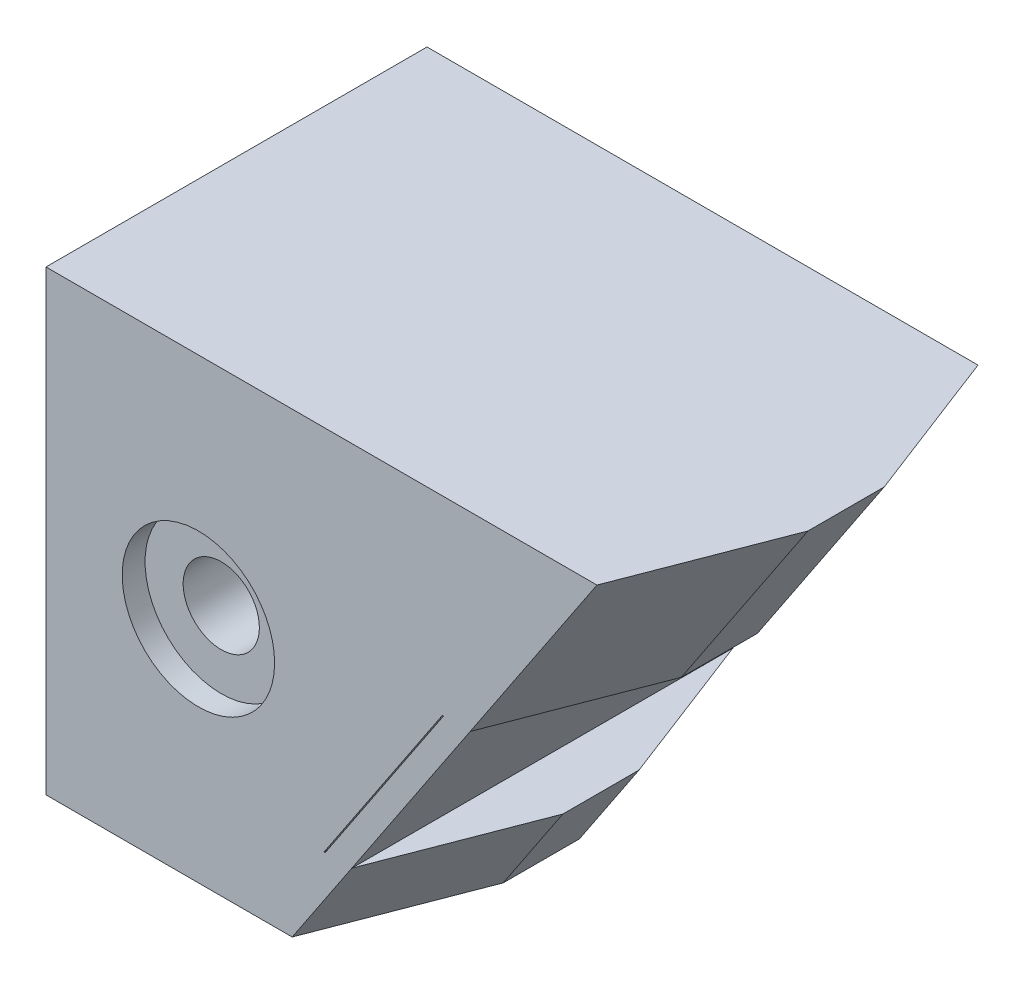
ISO-10303-21;
HEADER;
FILE_DESCRIPTION(('STEP AP214'),'2;1');
FILE_NAME('part.step','',(''),(''),'','','');
FILE_SCHEMA(('AUTOMOTIVE_DESIGN { 1 0 10303 214 1 1 1 1 }'));
ENDSEC;
DATA;
#1=APPLICATION_CONTEXT('core data for automotive mechanical design processes');
#2=APPLICATION_PROTOCOL_DEFINITION('international standard','automotive_design',2000,#1);
#3=PRODUCT_CONTEXT('',#1,'mechanical');
#4=PRODUCT('Part','Part','',(#3));
#5=PRODUCT_RELATED_PRODUCT_CATEGORY('part','',(#4));
#6=PRODUCT_DEFINITION_FORMATION('','',#4);
#7=PRODUCT_DEFINITION_CONTEXT('part definition',#1,'design');
#8=PRODUCT_DEFINITION('design','',#6,#7);
#9=PRODUCT_DEFINITION_SHAPE('','',#8);
#10=(LENGTH_UNIT() NAMED_UNIT(*) SI_UNIT(.MILLI.,.METRE.));
#11=(NAMED_UNIT(*) PLANE_ANGLE_UNIT() SI_UNIT($,.RADIAN.));
#12=(NAMED_UNIT(*) SI_UNIT($,.STERADIAN.) SOLID_ANGLE_UNIT());
#13=UNCERTAINTY_MEASURE_WITH_UNIT(LENGTH_MEASURE(1.E-05),#10,'distance_accuracy_value','');
#14=(GEOMETRIC_REPRESENTATION_CONTEXT(3) GLOBAL_UNCERTAINTY_ASSIGNED_CONTEXT((#13)) GLOBAL_UNIT_ASSIGNED_CONTEXT((#10,
#11,#12)) REPRESENTATION_CONTEXT('',''));
#15=CARTESIAN_POINT('',(0.,0.,0.));
#16=DIRECTION('',(0.,0.,1.));
#17=DIRECTION('',(1.,0.,0.));
#18=AXIS2_PLACEMENT_3D('',#15,#16,#17);
#19=CARTESIAN_POINT('',(0.,75.2062451279246,-50.));
#20=DIRECTION('',(0.,-1.,0.));
#21=DIRECTION('',(1.,0.,0.));
#22=AXIS2_PLACEMENT_3D('',#19,#20,#21);
#23=PLANE('',#22);
#24=DIRECTION('',(0.35911281384207,0.,-0.933294158845126));
#25=VECTOR('',#24,1.);
#26=CARTESIAN_POINT('',(0.399891815671286,75.2062451279246,-13.543816152655));
#27=LINE('',#26,#25);
#28=CARTESIAN_POINT('',(-4.81149612953786,75.2062451279246,0.));
#29=VERTEX_POINT('',#28);
#30=CARTESIAN_POINT('',(2.88410145753901,75.2062451279247,-20.));
#31=VERTEX_POINT('',#30);
#32=EDGE_CURVE('E60',#29,#31,#27,.T.);
#33=ORIENTED_EDGE('',*,*,#32,.T.);
#34=DIRECTION('',(0.,0.,1.));
#35=VECTOR('',#34,1.);
#36=CARTESIAN_POINT('',(2.88410145753922,75.2062451279246,-50.));
#37=LINE('',#36,#35);
#38=CARTESIAN_POINT('',(2.88410145753922,75.2062451279246,-29.9999999999994));
#39=VERTEX_POINT('',#38);
#40=EDGE_CURVE('E184',#39,#31,#37,.T.);
#41=ORIENTED_EDGE('',*,*,#40,.F.);
#42=DIRECTION('',(-0.35911281384207,0.,-0.933294158845126));
#43=VECTOR('',#42,1.);
#44=CARTESIAN_POINT('',(17.1577863919333,75.2062451279246,7.09571549937649));
#45=LINE('',#44,#43);
#46=CARTESIAN_POINT('',(-4.81149612953786,75.2062451279246,-50.));
#47=VERTEX_POINT('',#46);
#48=EDGE_CURVE('E245',#39,#47,#45,.T.);
#49=ORIENTED_EDGE('',*,*,#48,.T.);
#50=DIRECTION('',(1.,0.,0.));
#51=VECTOR('',#50,1.);
#52=CARTESIAN_POINT('',(0.,75.2062451279246,-50.));
#53=LINE('',#52,#51);
#54=CARTESIAN_POINT('',(-77.1158985424608,75.2062451279246,-50.));
#55=VERTEX_POINT('',#54);
#56=EDGE_CURVE('E200',#55,#47,#53,.T.);
#57=ORIENTED_EDGE('',*,*,#56,.F.);
#58=DIRECTION('',(0.,0.,1.));
#59=VECTOR('',#58,1.);
#60=CARTESIAN_POINT('',(-77.1158985424608,75.2062451279246,-50.));
#61=LINE('',#60,#59);
#62=CARTESIAN_POINT('',(-77.1158985424608,75.2062451279246,0.));
#63=VERTEX_POINT('',#62);
#64=EDGE_CURVE('E44',#55,#63,#61,.T.);
#65=ORIENTED_EDGE('',*,*,#64,.T.);
#66=DIRECTION('',(1.,0.,0.));
#67=VECTOR('',#66,1.);
#68=CARTESIAN_POINT('',(0.,75.2062451279246,0.));
#69=LINE('',#68,#67);
#70=EDGE_CURVE('E177',#63,#29,#69,.T.);
#71=ORIENTED_EDGE('',*,*,#70,.T.);
#72=EDGE_LOOP('',(#33,#41,#49,#57,#65,#71));
#73=FACE_BOUND('',#72,.T.);
#74=ADVANCED_FACE('F35',(#73),#23,.F.);
#75=CARTESIAN_POINT('',(-32.7138890499765,21.809259366651,-50.));
#76=DIRECTION('',(-0.832050294337844,0.554700196225229,0.));
#77=DIRECTION('',(-0.554700196225229,-0.832050294337844,0.));
#78=AXIS2_PLACEMENT_3D('',#75,#76,#77);
#79=PLANE('',#78);
#80=DIRECTION('',(-0.554700196225226,-0.832050294337846,0.));
#81=VECTOR('',#80,1.);
#82=CARTESIAN_POINT('',(2.88487068830827,75.2073989740786,-20.));
#83=LINE('',#82,#81);
#84=CARTESIAN_POINT('',(-13.7569044292177,50.2447362977893,-20.0000000000004));
#85=VERTEX_POINT('',#84);
#86=EDGE_CURVE('E263',#31,#85,#83,.T.);
#87=ORIENTED_EDGE('',*,*,#86,.T.);
#88=DIRECTION('',(0.,0.,1.));
#89=VECTOR('',#88,1.);
#90=CARTESIAN_POINT('',(-13.7569044292177,50.2447362977893,-50.));
#91=LINE('',#90,#89);
#92=CARTESIAN_POINT('',(-13.7569044292178,50.2447362977893,-30.));
#93=VERTEX_POINT('',#92);
#94=EDGE_CURVE('E187',#93,#85,#91,.T.);
#95=ORIENTED_EDGE('',*,*,#94,.F.);
#96=DIRECTION('',(-0.554700196225226,-0.832050294337846,0.));
#97=VECTOR('',#96,1.);
#98=CARTESIAN_POINT('',(2.88487068830825,75.2073989740786,-30.));
#99=LINE('',#98,#97);
#100=EDGE_CURVE('E255',#39,#93,#99,.T.);
#101=ORIENTED_EDGE('',*,*,#100,.F.);
#102=ORIENTED_EDGE('',*,*,#40,.T.);
#103=EDGE_LOOP('',(#87,#95,#101,#102));
#104=FACE_BOUND('',#103,.T.);
#105=ADVANCED_FACE('F301',(#104),#79,.F.);
#106=CARTESIAN_POINT('',(0.,50.2447362977893,-50.));
#107=DIRECTION('',(0.,1.,0.));
#108=DIRECTION('',(0.,0.,1.));
#109=AXIS2_PLACEMENT_3D('',#106,#107,#108);
#110=PLANE('',#109);
#111=DIRECTION('',(-0.35911281384207,0.,0.933294158845126));
#112=VECTOR('',#111,1.);
#113=CARTESIAN_POINT('',(-14.0950564524933,50.2447362977893,-19.1211805985195));
#114=LINE('',#113,#112);
#115=CARTESIAN_POINT('',(-21.4525020162946,50.2447362977893,0.));
#116=VERTEX_POINT('',#115);
#117=EDGE_CURVE('E260',#85,#116,#114,.T.);
#118=ORIENTED_EDGE('',*,*,#117,.T.);
#119=DIRECTION('',(0.,0.,1.));
#120=VECTOR('',#119,1.);
#121=CARTESIAN_POINT('',(-21.4525020162946,50.2447362977893,0.));
#122=LINE('',#121,#120);
#123=CARTESIAN_POINT('',(-21.4525020162946,50.2447362977893,-50.));
#124=VERTEX_POINT('',#123);
#125=EDGE_CURVE('E228',#124,#116,#122,.T.);
#126=ORIENTED_EDGE('',*,*,#125,.F.);
#127=DIRECTION('',(0.35911281384207,0.,0.933294158845126));
#128=VECTOR('',#127,1.);
#129=CARTESIAN_POINT('',(2.6628381237687,50.2447362977893,12.673079945241));
#130=LINE('',#129,#128);
#131=EDGE_CURVE('E250',#124,#93,#130,.T.);
#132=ORIENTED_EDGE('',*,*,#131,.T.);
#133=ORIENTED_EDGE('',*,*,#94,.T.);
#134=EDGE_LOOP('',(#118,#126,#132,#133));
#135=FACE_BOUND('',#134,.T.);
#136=ADVANCED_FACE('F306',(#135),#110,.F.);
#137=CARTESIAN_POINT('',(0.,0.,-50.));
#138=DIRECTION('',(0.,0.,1.));
#139=DIRECTION('',(1.,0.,0.));
#140=AXIS2_PLACEMENT_3D('',#137,#138,#139);
#141=PLANE('',#140);
#142=CARTESIAN_POINT('',(-57.1158985424608,45.2062451279246,-50.));
#143=DIRECTION('',(0.,0.,1.));
#144=DIRECTION('',(1.,0.,0.));
#145=AXIS2_PLACEMENT_3D('',#142,#143,#144);
#146=CIRCLE('',#145,5.00000003299998);
#147=CARTESIAN_POINT('',(-52.1158985094608,45.2062451279246,-50.));
#148=VERTEX_POINT('',#147);
#149=EDGE_CURVE('E163',#148,#148,#146,.T.);
#150=ORIENTED_EDGE('',*,*,#149,.T.);
#151=EDGE_LOOP('',(#150));
#152=FACE_BOUND('',#151,.T.);
#153=DIRECTION('',(-0.554700196225226,-0.832050294337846,0.));
#154=VECTOR('',#153,1.);
#155=CARTESIAN_POINT('',(-4.86833480752101,80.3769396721483,-50.));
#156=LINE('',#155,#154);
#157=CARTESIAN_POINT('',(-24.9564703904269,50.2447362977893,-50.));
#158=VERTEX_POINT('',#157);
#159=CARTESIAN_POINT('',(-40.4880758847332,26.9473280563296,-50.));
#160=VERTEX_POINT('',#159);
#161=EDGE_CURVE('E224',#158,#160,#156,.T.);
#162=ORIENTED_EDGE('',*,*,#161,.F.);
#163=DIRECTION('',(-1.,0.,0.));
#164=VECTOR('',#163,1.);
#165=CARTESIAN_POINT('',(0.,50.2447362977893,-50.));
#166=LINE('',#165,#164);
#167=CARTESIAN_POINT('',(-25.1095317961878,50.2447362977893,-50.));
#168=VERTEX_POINT('',#167);
#169=EDGE_CURVE('E205',#158,#168,#166,.T.);
#170=ORIENTED_EDGE('',*,*,#169,.T.);
#171=DIRECTION('',(-0.554700196225229,-0.832050294337844,0.));
#172=VECTOR('',#171,1.);
#173=CARTESIAN_POINT('',(-40.5734003040327,27.0489335360218,-50.));
#174=LINE('',#173,#172);
#175=CARTESIAN_POINT('',(-40.6411372904942,26.9473280563296,-50.));
#176=VERTEX_POINT('',#175);
#177=EDGE_CURVE('E208',#168,#176,#174,.T.);
#178=ORIENTED_EDGE('',*,*,#177,.T.);
#179=DIRECTION('',(1.,0.,0.));
#180=VECTOR('',#179,1.);
#181=CARTESIAN_POINT('',(0.,26.9473280563296,-50.));
#182=LINE('',#181,#180);
#183=EDGE_CURVE('E212',#176,#160,#182,.T.);
#184=ORIENTED_EDGE('',*,*,#183,.T.);
#185=EDGE_LOOP('',(#162,#170,#178,#184));
#186=FACE_BOUND('',#185,.T.);
#187=DIRECTION('',(-0.554700196225226,-0.832050294337846,0.));
#188=VECTOR('',#187,1.);
#189=CARTESIAN_POINT('',(-2.44251054850634,78.7597234994719,-50.));
#190=LINE('',#189,#188);
#191=CARTESIAN_POINT('',(-36.9841075106009,26.9473280563296,-50.));
#192=VERTEX_POINT('',#191);
#193=EDGE_CURVE('E232',#124,#192,#190,.T.);
#194=ORIENTED_EDGE('',*,*,#193,.T.);
#195=DIRECTION('',(0.554700196225226,0.832050294337846,0.));
#196=VECTOR('',#195,1.);
#197=CARTESIAN_POINT('',(-54.75208148736,0.295367091190813,-50.));
#198=LINE('',#197,#196);
#199=CARTESIAN_POINT('',(-44.8114961295375,15.2062451279246,-50.));
#200=VERTEX_POINT('',#199);
#201=EDGE_CURVE('E267',#200,#192,#198,.T.);
#202=ORIENTED_EDGE('',*,*,#201,.F.);
#203=DIRECTION('',(-1.,0.,0.));
#204=VECTOR('',#203,1.);
#205=CARTESIAN_POINT('',(0.,15.2062451279246,-50.));
#206=LINE('',#205,#204);
#207=CARTESIAN_POINT('',(-77.1158985424608,15.2062451279246,-50.));
#208=VERTEX_POINT('',#207);
#209=EDGE_CURVE('E180',#200,#208,#206,.T.);
#210=ORIENTED_EDGE('',*,*,#209,.T.);
#211=DIRECTION('',(0.,1.,0.));
#212=VECTOR('',#211,1.);
#213=CARTESIAN_POINT('',(-77.1158985424608,0.,-50.));
#214=LINE('',#213,#212);
#215=EDGE_CURVE('E171',#208,#55,#214,.T.);
#216=ORIENTED_EDGE('',*,*,#215,.T.);
#217=ORIENTED_EDGE('',*,*,#56,.T.);
#218=DIRECTION('',(-0.554700196225226,-0.832050294337846,0.));
#219=VECTOR('',#218,1.);
#220=CARTESIAN_POINT('',(-2.44285071812954,78.7592132450371,-50.));
#221=LINE('',#220,#219);
#222=EDGE_CURVE('E253',#47,#124,#221,.T.);
#223=ORIENTED_EDGE('',*,*,#222,.T.);
#224=EDGE_LOOP('',(#194,#202,#210,#216,#217,#223));
#225=FACE_BOUND('',#224,.T.);
#226=ADVANCED_FACE('F285',(#152,#186,#225),#141,.F.);
#227=CARTESIAN_POINT('',(0.,0.,0.));
#228=DIRECTION('',(0.,0.,1.));
#229=DIRECTION('',(1.,0.,0.));
#230=AXIS2_PLACEMENT_3D('',#227,#228,#229);
#231=PLANE('',#230);
#232=DIRECTION('',(-1.,0.,0.));
#233=VECTOR('',#232,1.);
#234=CARTESIAN_POINT('',(0.,50.2447362977893,0.));
#235=LINE('',#234,#233);
#236=CARTESIAN_POINT('',(-24.9564703904269,50.2447362977893,0.));
#237=VERTEX_POINT('',#236);
#238=CARTESIAN_POINT('',(-25.1095317961878,50.2447362977893,0.));
#239=VERTEX_POINT('',#238);
#240=EDGE_CURVE('E175',#237,#239,#235,.T.);
#241=ORIENTED_EDGE('',*,*,#240,.F.);
#242=DIRECTION('',(-0.554700196225226,-0.832050294337846,0.));
#243=VECTOR('',#242,1.);
#244=CARTESIAN_POINT('',(-4.868334807521,80.3769396721483,0.));
#245=LINE('',#244,#243);
#246=CARTESIAN_POINT('',(-40.4880758847332,26.9473280563296,0.));
#247=VERTEX_POINT('',#246);
#248=EDGE_CURVE('E238',#237,#247,#245,.T.);
#249=ORIENTED_EDGE('',*,*,#248,.T.);
#250=DIRECTION('',(1.,0.,0.));
#251=VECTOR('',#250,1.);
#252=CARTESIAN_POINT('',(0.,26.9473280563296,0.));
#253=LINE('',#252,#251);
#254=CARTESIAN_POINT('',(-40.6411372904942,26.9473280563296,0.));
#255=VERTEX_POINT('',#254);
#256=EDGE_CURVE('E162',#255,#247,#253,.T.);
#257=ORIENTED_EDGE('',*,*,#256,.F.);
#258=DIRECTION('',(-0.554700196225229,-0.832050294337844,0.));
#259=VECTOR('',#258,1.);
#260=CARTESIAN_POINT('',(-40.5734003040327,27.0489335360218,0.));
#261=LINE('',#260,#259);
#262=EDGE_CURVE('E165',#239,#255,#261,.T.);
#263=ORIENTED_EDGE('',*,*,#262,.F.);
#264=EDGE_LOOP('',(#241,#249,#257,#263));
#265=FACE_BOUND('',#264,.T.);
#266=CARTESIAN_POINT('',(-57.1158985424608,45.2062451279246,0.));
#267=DIRECTION('',(0.,0.,1.));
#268=DIRECTION('',(1.,0.,0.));
#269=AXIS2_PLACEMENT_3D('',#266,#267,#268);
#270=CIRCLE('',#269,9.999999939);
#271=CARTESIAN_POINT('',(-47.1158986034608,45.2062451279246,0.));
#272=VERTEX_POINT('',#271);
#273=EDGE_CURVE('E221',#272,#272,#270,.T.);
#274=ORIENTED_EDGE('',*,*,#273,.F.);
#275=EDGE_LOOP('',(#274));
#276=FACE_BOUND('',#275,.T.);
#277=DIRECTION('',(-0.554700196225226,-0.832050294337846,0.));
#278=VECTOR('',#277,1.);
#279=CARTESIAN_POINT('',(-2.44251054850633,78.7597234994719,0.));
#280=LINE('',#279,#278);
#281=CARTESIAN_POINT('',(-36.9841075106009,26.9473280563297,0.));
#282=VERTEX_POINT('',#281);
#283=EDGE_CURVE('E235',#116,#282,#280,.T.);
#284=ORIENTED_EDGE('',*,*,#283,.F.);
#285=DIRECTION('',(-0.554700196225226,-0.832050294337846,0.));
#286=VECTOR('',#285,1.);
#287=CARTESIAN_POINT('',(-2.44285071812953,78.7592132450371,0.));
#288=LINE('',#287,#286);
#289=EDGE_CURVE('E148',#29,#116,#288,.T.);
#290=ORIENTED_EDGE('',*,*,#289,.F.);
#291=ORIENTED_EDGE('',*,*,#70,.F.);
#292=DIRECTION('',(0.,1.,0.));
#293=VECTOR('',#292,1.);
#294=CARTESIAN_POINT('',(-77.1158985424608,0.,0.));
#295=LINE('',#294,#293);
#296=CARTESIAN_POINT('',(-77.1158985424608,15.2062451279246,0.));
#297=VERTEX_POINT('',#296);
#298=EDGE_CURVE('E161',#297,#63,#295,.T.);
#299=ORIENTED_EDGE('',*,*,#298,.F.);
#300=DIRECTION('',(-1.,0.,0.));
#301=VECTOR('',#300,1.);
#302=CARTESIAN_POINT('',(0.,15.2062451279246,0.));
#303=LINE('',#302,#301);
#304=CARTESIAN_POINT('',(-44.8114961295375,15.2062451279246,0.));
#305=VERTEX_POINT('',#304);
#306=EDGE_CURVE('E155',#305,#297,#303,.T.);
#307=ORIENTED_EDGE('',*,*,#306,.F.);
#308=DIRECTION('',(0.554700196225226,0.832050294337846,0.));
#309=VECTOR('',#308,1.);
#310=CARTESIAN_POINT('',(-54.7520814873599,0.295367091190813,0.));
#311=LINE('',#310,#309);
#312=EDGE_CURVE('E137',#305,#282,#311,.T.);
#313=ORIENTED_EDGE('',*,*,#312,.T.);
#314=EDGE_LOOP('',(#284,#290,#291,#299,#307,#313));
#315=FACE_BOUND('',#314,.T.);
#316=ADVANCED_FACE('F159',(#265,#276,#315),#231,.T.);
#317=DIRECTION('',(0.,0.,1.));
#318=VECTOR('',#317,1.);
#319=CARTESIAN_POINT('',(-24.9564703904269,50.2447362977893,0.));
#320=LINE('',#319,#318);
#321=EDGE_CURVE('E225',#158,#237,#320,.T.);
#322=ORIENTED_EDGE('',*,*,#321,.T.);
#323=ORIENTED_EDGE('',*,*,#240,.T.);
#324=DIRECTION('',(0.,0.,1.));
#325=VECTOR('',#324,1.);
#326=CARTESIAN_POINT('',(-25.1095317961878,50.2447362977893,-50.));
#327=LINE('',#326,#325);
#328=EDGE_CURVE('E190',#168,#239,#327,.T.);
#329=ORIENTED_EDGE('',*,*,#328,.F.);
#330=ORIENTED_EDGE('',*,*,#169,.F.);
#331=EDGE_LOOP('',(#322,#323,#329,#330));
#332=FACE_BOUND('',#331,.T.);
#333=ADVANCED_FACE('F315',(#332),#110,.F.);
#334=CARTESIAN_POINT('',(0.,26.9473280563296,-50.));
#335=DIRECTION('',(0.,-1.,0.));
#336=DIRECTION('',(0.,0.,-1.));
#337=AXIS2_PLACEMENT_3D('',#334,#335,#336);
#338=PLANE('',#337);
#339=DIRECTION('',(0.,0.,1.));
#340=VECTOR('',#339,1.);
#341=CARTESIAN_POINT('',(-40.4880758847332,26.9473280563296,0.));
#342=LINE('',#341,#340);
#343=EDGE_CURVE('E229',#160,#247,#342,.T.);
#344=ORIENTED_EDGE('',*,*,#343,.F.);
#345=ORIENTED_EDGE('',*,*,#183,.F.);
#346=DIRECTION('',(0.,0.,1.));
#347=VECTOR('',#346,1.);
#348=CARTESIAN_POINT('',(-40.6411372904942,26.9473280563296,-50.));
#349=LINE('',#348,#347);
#350=EDGE_CURVE('E193',#176,#255,#349,.T.);
#351=ORIENTED_EDGE('',*,*,#350,.T.);
#352=ORIENTED_EDGE('',*,*,#256,.T.);
#353=EDGE_LOOP('',(#344,#345,#351,#352));
#354=FACE_BOUND('',#353,.T.);
#355=ADVANCED_FACE('F299',(#354),#338,.F.);
#356=CARTESIAN_POINT('',(0.,15.2062451279246,-50.));
#357=DIRECTION('',(0.,1.,0.));
#358=DIRECTION('',(0.,0.,1.));
#359=AXIS2_PLACEMENT_3D('',#356,#357,#358);
#360=PLANE('',#359);
#361=ORIENTED_EDGE('',*,*,#209,.F.);
#362=DIRECTION('',(-0.35911281384207,0.,-0.933294158845126));
#363=VECTOR('',#362,1.);
#364=CARTESIAN_POINT('',(-24.429636787355,15.2062451279246,2.9701796684635));
#365=LINE('',#364,#363);
#366=CARTESIAN_POINT('',(-37.1158985424608,15.2062451279246,-30.));
#367=VERTEX_POINT('',#366);
#368=EDGE_CURVE('E52',#367,#200,#365,.T.);
#369=ORIENTED_EDGE('',*,*,#368,.F.);
#370=DIRECTION('',(0.,0.,1.));
#371=VECTOR('',#370,1.);
#372=CARTESIAN_POINT('',(-37.1158985424608,15.2062451279246,-50.));
#373=LINE('',#372,#371);
#374=CARTESIAN_POINT('',(-37.1158985424607,15.2062451279246,-20.));
#375=VERTEX_POINT('',#374);
#376=EDGE_CURVE('E39',#367,#375,#373,.T.);
#377=ORIENTED_EDGE('',*,*,#376,.T.);
#378=DIRECTION('',(0.35911281384207,0.,-0.933294158845126));
#379=VECTOR('',#378,1.);
#380=CARTESIAN_POINT('',(-41.187531363617,15.2062451279246,-9.41828032174196));
#381=LINE('',#380,#379);
#382=EDGE_CURVE('E140',#305,#375,#381,.T.);
#383=ORIENTED_EDGE('',*,*,#382,.F.);
#384=ORIENTED_EDGE('',*,*,#306,.T.);
#385=DIRECTION('',(0.,0.,1.));
#386=VECTOR('',#385,1.);
#387=CARTESIAN_POINT('',(-77.1158985424608,15.2062451279246,-50.));
#388=LINE('',#387,#386);
#389=EDGE_CURVE('E11',#208,#297,#388,.T.);
#390=ORIENTED_EDGE('',*,*,#389,.F.);
#391=EDGE_LOOP('',(#361,#369,#377,#383,#384,#390));
#392=FACE_BOUND('',#391,.T.);
#393=ADVANCED_FACE('F37',(#392),#360,.F.);
#394=CARTESIAN_POINT('',(-77.1158985424608,0.,-50.));
#395=DIRECTION('',(1.,0.,0.));
#396=DIRECTION('',(0.,1.,0.));
#397=AXIS2_PLACEMENT_3D('',#394,#395,#396);
#398=PLANE('',#397);
#399=ORIENTED_EDGE('',*,*,#298,.T.);
#400=ORIENTED_EDGE('',*,*,#64,.F.);
#401=ORIENTED_EDGE('',*,*,#215,.F.);
#402=ORIENTED_EDGE('',*,*,#389,.T.);
#403=EDGE_LOOP('',(#399,#400,#401,#402));
#404=FACE_BOUND('',#403,.T.);
#405=ADVANCED_FACE('F284',(#404),#398,.F.);
#406=CARTESIAN_POINT('',(-40.5734003040327,27.0489335360218,-50.));
#407=DIRECTION('',(-0.832050294337844,0.554700196225229,0.));
#408=DIRECTION('',(-0.554700196225229,-0.832050294337843,0.));
#409=AXIS2_PLACEMENT_3D('',#406,#407,#408);
#410=PLANE('',#409);
#411=ORIENTED_EDGE('',*,*,#262,.T.);
#412=ORIENTED_EDGE('',*,*,#350,.F.);
#413=ORIENTED_EDGE('',*,*,#177,.F.);
#414=ORIENTED_EDGE('',*,*,#328,.T.);
#415=EDGE_LOOP('',(#411,#412,#413,#414));
#416=FACE_BOUND('',#415,.T.);
#417=ADVANCED_FACE('F297',(#416),#410,.F.);
#418=DIRECTION('',(0.,0.,1.));
#419=VECTOR('',#418,1.);
#420=CARTESIAN_POINT('',(-29.2885099235241,26.9473280563296,-50.));
#421=LINE('',#420,#419);
#422=CARTESIAN_POINT('',(-29.2885099235241,26.9473280563297,-30.));
#423=VERTEX_POINT('',#422);
#424=CARTESIAN_POINT('',(-29.2885099235241,26.9473280563296,-20.));
#425=VERTEX_POINT('',#424);
#426=EDGE_CURVE('E195',#423,#425,#421,.T.);
#427=ORIENTED_EDGE('',*,*,#426,.F.);
#428=DIRECTION('',(0.35911281384207,0.,0.933294158845126));
#429=VECTOR('',#428,1.);
#430=CARTESIAN_POINT('',(-17.6116839617629,26.9473280563296,0.346768602792027));
#431=LINE('',#430,#429);
#432=EDGE_CURVE('E259',#192,#423,#431,.T.);
#433=ORIENTED_EDGE('',*,*,#432,.F.);
#434=DIRECTION('',(0.,0.,1.));
#435=VECTOR('',#434,1.);
#436=CARTESIAN_POINT('',(-36.9841075106009,26.9473280563296,0.));
#437=LINE('',#436,#435);
#438=EDGE_CURVE('E243',#192,#282,#437,.T.);
#439=ORIENTED_EDGE('',*,*,#438,.T.);
#440=DIRECTION('',(-0.35911281384207,0.,0.933294158845126));
#441=VECTOR('',#440,1.);
#442=CARTESIAN_POINT('',(-34.369578538025,26.9473280563296,-6.79486925607048));
#443=LINE('',#442,#441);
#444=EDGE_CURVE('E143',#425,#282,#443,.T.);
#445=ORIENTED_EDGE('',*,*,#444,.F.);
#446=EDGE_LOOP('',(#427,#433,#439,#445));
#447=FACE_BOUND('',#446,.T.);
#448=ADVANCED_FACE('F274',(#447),#338,.F.);
#449=CARTESIAN_POINT('',(-32.7138890499765,21.809259366651,-50.));
#450=DIRECTION('',(-0.832050294337844,0.554700196225229,0.));
#451=DIRECTION('',(-0.554700196225229,-0.832050294337844,0.));
#452=AXIS2_PLACEMENT_3D('',#449,#450,#451);
#453=PLANE('',#452);
#454=ORIENTED_EDGE('',*,*,#376,.F.);
#455=DIRECTION('',(0.554700196225226,0.832050294337846,0.));
#456=VECTOR('',#455,1.);
#457=CARTESIAN_POINT('',(-49.4243600809222,-3.25644717976768,-30.));
#458=LINE('',#457,#456);
#459=EDGE_CURVE('E257',#367,#423,#458,.T.);
#460=ORIENTED_EDGE('',*,*,#459,.T.);
#461=ORIENTED_EDGE('',*,*,#426,.T.);
#462=DIRECTION('',(0.554700196225226,0.832050294337846,0.));
#463=VECTOR('',#462,1.);
#464=CARTESIAN_POINT('',(-49.4243600809221,-3.25644717976769,-20.));
#465=LINE('',#464,#463);
#466=EDGE_CURVE('E149',#375,#425,#465,.T.);
#467=ORIENTED_EDGE('',*,*,#466,.F.);
#468=EDGE_LOOP('',(#454,#460,#461,#467));
#469=FACE_BOUND('',#468,.T.);
#470=ADVANCED_FACE('F287',(#469),#453,.F.);
#471=CARTESIAN_POINT('',(-57.1158985424608,45.2062451279246,0.));
#472=DIRECTION('',(0.,0.,1.));
#473=DIRECTION('',(1.,0.,0.));
#474=AXIS2_PLACEMENT_3D('',#471,#472,#473);
#475=CYLINDRICAL_SURFACE('',#474,5.000000033);
#476=ORIENTED_EDGE('',*,*,#149,.F.);
#477=EDGE_LOOP('',(#476));
#478=FACE_BOUND('',#477,.T.);
#479=CARTESIAN_POINT('',(-57.1158985424608,45.2062451279246,-3.000000096));
#480=DIRECTION('',(0.,0.,1.));
#481=DIRECTION('',(1.,0.,0.));
#482=AXIS2_PLACEMENT_3D('',#479,#480,#481);
#483=CIRCLE('',#482,5.00000003300001);
#484=CARTESIAN_POINT('',(-52.1158985094608,45.2062451279246,-3.000000096));
#485=VERTEX_POINT('',#484);
#486=EDGE_CURVE('E168',#485,#485,#483,.T.);
#487=ORIENTED_EDGE('',*,*,#486,.T.);
#488=EDGE_LOOP('',(#487));
#489=FACE_BOUND('',#488,.T.);
#490=ADVANCED_FACE('F289',(#478,#489),#475,.F.);
#491=CARTESIAN_POINT('',(-52.1158985094608,45.2062451279246,-3.000000096));
#492=DIRECTION('',(0.,0.,-1.));
#493=DIRECTION('',(-1.,0.,0.));
#494=AXIS2_PLACEMENT_3D('',#491,#492,#493);
#495=PLANE('',#494);
#496=ORIENTED_EDGE('',*,*,#486,.F.);
#497=EDGE_LOOP('',(#496));
#498=FACE_BOUND('',#497,.T.);
#499=CARTESIAN_POINT('',(-57.1158985424608,45.2062451279246,-3.000000096));
#500=DIRECTION('',(0.,0.,1.));
#501=DIRECTION('',(1.,0.,0.));
#502=AXIS2_PLACEMENT_3D('',#499,#500,#501);
#503=CIRCLE('',#502,9.999999939);
#504=CARTESIAN_POINT('',(-47.1158986034608,45.2062451279246,-3.000000096));
#505=VERTEX_POINT('',#504);
#506=EDGE_CURVE('E218',#505,#505,#503,.T.);
#507=ORIENTED_EDGE('',*,*,#506,.T.);
#508=EDGE_LOOP('',(#507));
#509=FACE_BOUND('',#508,.T.);
#510=ADVANCED_FACE('F294',(#498,#509),#495,.F.);
#511=CARTESIAN_POINT('',(-57.1158985424608,45.2062451279246,0.));
#512=DIRECTION('',(0.,0.,1.));
#513=DIRECTION('',(1.,0.,0.));
#514=AXIS2_PLACEMENT_3D('',#511,#512,#513);
#515=CYLINDRICAL_SURFACE('',#514,9.999999939);
#516=ORIENTED_EDGE('',*,*,#506,.F.);
#517=EDGE_LOOP('',(#516));
#518=FACE_BOUND('',#517,.T.);
#519=ORIENTED_EDGE('',*,*,#273,.T.);
#520=EDGE_LOOP('',(#519));
#521=FACE_BOUND('',#520,.T.);
#522=ADVANCED_FACE('F350',(#518,#521),#515,.F.);
#523=CARTESIAN_POINT('',(-4.868334807521,80.3769396721483,0.));
#524=DIRECTION('',(0.832050294337846,-0.554700196225226,0.));
#525=DIRECTION('',(0.554700196225226,0.832050294337846,0.));
#526=AXIS2_PLACEMENT_3D('',#523,#524,#525);
#527=PLANE('',#526);
#528=ORIENTED_EDGE('',*,*,#321,.F.);
#529=ORIENTED_EDGE('',*,*,#161,.T.);
#530=ORIENTED_EDGE('',*,*,#343,.T.);
#531=ORIENTED_EDGE('',*,*,#248,.F.);
#532=EDGE_LOOP('',(#528,#529,#530,#531));
#533=FACE_BOUND('',#532,.T.);
#534=ADVANCED_FACE('F333',(#533),#527,.F.);
#535=CARTESIAN_POINT('',(-2.44251054850633,78.7597234994719,0.));
#536=DIRECTION('',(0.832050294337846,-0.554700196225226,0.));
#537=DIRECTION('',(0.554700196225226,0.832050294337846,0.));
#538=AXIS2_PLACEMENT_3D('',#535,#536,#537);
#539=PLANE('',#538);
#540=ORIENTED_EDGE('',*,*,#193,.F.);
#541=ORIENTED_EDGE('',*,*,#125,.T.);
#542=ORIENTED_EDGE('',*,*,#283,.T.);
#543=ORIENTED_EDGE('',*,*,#438,.F.);
#544=EDGE_LOOP('',(#540,#541,#542,#543));
#545=FACE_BOUND('',#544,.T.);
#546=ADVANCED_FACE('F279',(#545),#539,.T.);
#547=CARTESIAN_POINT('',(-51.2153331229314,-2.06246515176153,-13.2767766728752));
#548=DIRECTION('',(-0.792428851750329,0.528285901166882,-0.304910677972993));
#549=DIRECTION('',(-0.554700196225226,-0.832050294337846,0.));
#550=AXIS2_PLACEMENT_3D('',#547,#548,#549);
#551=PLANE('',#550);
#552=ORIENTED_EDGE('',*,*,#382,.T.);
#553=ORIENTED_EDGE('',*,*,#466,.T.);
#554=ORIENTED_EDGE('',*,*,#444,.T.);
#555=ORIENTED_EDGE('',*,*,#312,.F.);
#556=EDGE_LOOP('',(#552,#553,#554,#555));
#557=FACE_BOUND('',#556,.T.);
#558=ADVANCED_FACE('F139',(#557),#551,.F.);
#559=CARTESIAN_POINT('',(1.09389764629902,76.4013810020848,-13.2767766728752));
#560=DIRECTION('',(0.792428851750329,-0.528285901166882,0.304910677972993));
#561=DIRECTION('',(0.554700196225226,0.832050294337846,0.));
#562=AXIS2_PLACEMENT_3D('',#559,#560,#561);
#563=PLANE('',#562);
#564=ORIENTED_EDGE('',*,*,#289,.T.);
#565=ORIENTED_EDGE('',*,*,#117,.F.);
#566=ORIENTED_EDGE('',*,*,#86,.F.);
#567=ORIENTED_EDGE('',*,*,#32,.F.);
#568=EDGE_LOOP('',(#564,#565,#566,#567));
#569=FACE_BOUND('',#568,.T.);
#570=ADVANCED_FACE('F362',(#569),#563,.T.);
#571=CARTESIAN_POINT('',(13.1748985679267,68.3473803876664,8.62825059577765));
#572=DIRECTION('',(0.79242885175033,-0.528285901166882,-0.304910677972993));
#573=DIRECTION('',(0.554700196225226,0.832050294337846,0.));
#574=AXIS2_PLACEMENT_3D('',#571,#572,#573);
#575=PLANE('',#574);
#576=ORIENTED_EDGE('',*,*,#100,.T.);
#577=ORIENTED_EDGE('',*,*,#131,.F.);
#578=ORIENTED_EDGE('',*,*,#222,.F.);
#579=ORIENTED_EDGE('',*,*,#48,.F.);
#580=EDGE_LOOP('',(#576,#577,#578,#579));
#581=FACE_BOUND('',#580,.T.);
#582=ADVANCED_FACE('F359',(#581),#575,.T.);
#583=CARTESIAN_POINT('',(-39.1343322013038,-10.1164657661799,8.62825059577765));
#584=DIRECTION('',(-0.792428851750329,0.528285901166882,0.304910677972993));
#585=DIRECTION('',(-0.554700196225226,-0.832050294337846,0.));
#586=AXIS2_PLACEMENT_3D('',#583,#584,#585);
#587=PLANE('',#586);
#588=ORIENTED_EDGE('',*,*,#368,.T.);
#589=ORIENTED_EDGE('',*,*,#201,.T.);
#590=ORIENTED_EDGE('',*,*,#432,.T.);
#591=ORIENTED_EDGE('',*,*,#459,.F.);
#592=EDGE_LOOP('',(#588,#589,#590,#591));
#593=FACE_BOUND('',#592,.T.);
#594=ADVANCED_FACE('F286',(#593),#587,.F.);
#595=CLOSED_SHELL('',(#74,#105,#136,#226,#316,#333,#355,#393,#405,#417,#448,#470,#490,#510,#522,
#534,#546,#558,#570,#582,#594));
#596=MANIFOLD_SOLID_BREP('B2',#595);
#597=ADVANCED_BREP_SHAPE_REPRESENTATION('',(#18,#596),#14);
#598=SHAPE_DEFINITION_REPRESENTATION(#9,#597);
ENDSEC;
END-ISO-10303-21;
